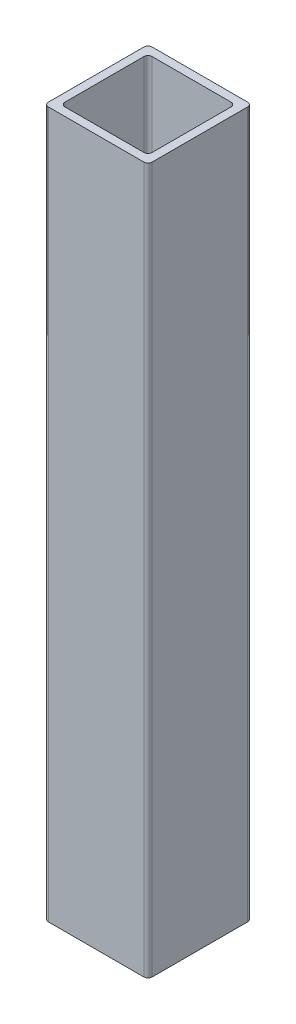
ISO-10303-21;
HEADER;
FILE_DESCRIPTION(('STEP AP214'),'2;1');
FILE_NAME('part.step','',(''),(''),'','','');
FILE_SCHEMA(('AUTOMOTIVE_DESIGN { 1 0 10303 214 1 1 1 1 }'));
ENDSEC;
DATA;
#1=APPLICATION_CONTEXT('core data for automotive mechanical design processes');
#2=APPLICATION_PROTOCOL_DEFINITION('international standard','automotive_design',2000,#1);
#3=PRODUCT_CONTEXT('',#1,'mechanical');
#4=PRODUCT('Part','Part','',(#3));
#5=PRODUCT_RELATED_PRODUCT_CATEGORY('part','',(#4));
#6=PRODUCT_DEFINITION_FORMATION('','',#4);
#7=PRODUCT_DEFINITION_CONTEXT('part definition',#1,'design');
#8=PRODUCT_DEFINITION('design','',#6,#7);
#9=PRODUCT_DEFINITION_SHAPE('','',#8);
#10=(LENGTH_UNIT() NAMED_UNIT(*) SI_UNIT(.MILLI.,.METRE.));
#11=(NAMED_UNIT(*) PLANE_ANGLE_UNIT() SI_UNIT($,.RADIAN.));
#12=(NAMED_UNIT(*) SI_UNIT($,.STERADIAN.) SOLID_ANGLE_UNIT());
#13=UNCERTAINTY_MEASURE_WITH_UNIT(LENGTH_MEASURE(1.E-05),#10,'distance_accuracy_value','');
#14=(GEOMETRIC_REPRESENTATION_CONTEXT(3) GLOBAL_UNCERTAINTY_ASSIGNED_CONTEXT((#13)) GLOBAL_UNIT_ASSIGNED_CONTEXT((#10,
#11,#12)) REPRESENTATION_CONTEXT('',''));
#15=CARTESIAN_POINT('',(0.,0.,0.));
#16=DIRECTION('',(0.,0.,1.));
#17=DIRECTION('',(1.,0.,0.));
#18=AXIS2_PLACEMENT_3D('',#15,#16,#17);
#19=CARTESIAN_POINT('',(-11.5,170.,11.5));
#20=DIRECTION('',(0.,-1.,0.));
#21=DIRECTION('',(0.,0.,-1.));
#22=AXIS2_PLACEMENT_3D('',#19,#20,#21);
#23=PLANE('',#22);
#24=CARTESIAN_POINT('',(-11.5,170.,11.5));
#25=DIRECTION('',(0.,1.,0.));
#26=DIRECTION('',(0.,0.,-1.));
#27=AXIS2_PLACEMENT_3D('',#24,#25,#26);
#28=CIRCLE('',#27,1.);
#29=CARTESIAN_POINT('',(-12.5,170.,11.5));
#30=VERTEX_POINT('',#29);
#31=CARTESIAN_POINT('',(-11.5,170.,12.5));
#32=VERTEX_POINT('',#31);
#33=EDGE_CURVE('E217',#30,#32,#28,.T.);
#34=ORIENTED_EDGE('',*,*,#33,.T.);
#35=DIRECTION('',(1.,0.,0.));
#36=VECTOR('',#35,1.);
#37=CARTESIAN_POINT('',(-11.5,170.,12.5));
#38=LINE('',#37,#36);
#39=CARTESIAN_POINT('',(11.5,170.,12.5));
#40=VERTEX_POINT('',#39);
#41=EDGE_CURVE('E220',#32,#40,#38,.T.);
#42=ORIENTED_EDGE('',*,*,#41,.T.);
#43=CARTESIAN_POINT('',(11.5,170.,11.5));
#44=DIRECTION('',(0.,1.,0.));
#45=DIRECTION('',(0.,0.,1.));
#46=AXIS2_PLACEMENT_3D('',#43,#44,#45);
#47=CIRCLE('',#46,1.);
#48=CARTESIAN_POINT('',(12.5,170.,11.5));
#49=VERTEX_POINT('',#48);
#50=EDGE_CURVE('E223',#40,#49,#47,.T.);
#51=ORIENTED_EDGE('',*,*,#50,.T.);
#52=DIRECTION('',(0.,0.,-1.));
#53=VECTOR('',#52,1.);
#54=CARTESIAN_POINT('',(12.5,170.,11.5));
#55=LINE('',#54,#53);
#56=CARTESIAN_POINT('',(12.5,170.,-11.5));
#57=VERTEX_POINT('',#56);
#58=EDGE_CURVE('E225',#49,#57,#55,.T.);
#59=ORIENTED_EDGE('',*,*,#58,.T.);
#60=CARTESIAN_POINT('',(11.5,170.,-11.5));
#61=DIRECTION('',(0.,1.,0.));
#62=DIRECTION('',(0.,0.,-1.));
#63=AXIS2_PLACEMENT_3D('',#60,#61,#62);
#64=CIRCLE('',#63,1.);
#65=CARTESIAN_POINT('',(11.5,170.,-12.5));
#66=VERTEX_POINT('',#65);
#67=EDGE_CURVE('E227',#57,#66,#64,.T.);
#68=ORIENTED_EDGE('',*,*,#67,.T.);
#69=DIRECTION('',(-1.,0.,0.));
#70=VECTOR('',#69,1.);
#71=CARTESIAN_POINT('',(-11.5,170.,-12.5));
#72=LINE('',#71,#70);
#73=CARTESIAN_POINT('',(-11.5,170.,-12.5));
#74=VERTEX_POINT('',#73);
#75=EDGE_CURVE('E229',#66,#74,#72,.T.);
#76=ORIENTED_EDGE('',*,*,#75,.T.);
#77=CARTESIAN_POINT('',(-11.5,170.,-11.5));
#78=DIRECTION('',(0.,1.,0.));
#79=DIRECTION('',(0.,0.,-1.));
#80=AXIS2_PLACEMENT_3D('',#77,#78,#79);
#81=CIRCLE('',#80,1.);
#82=CARTESIAN_POINT('',(-12.5,170.,-11.5));
#83=VERTEX_POINT('',#82);
#84=EDGE_CURVE('E231',#74,#83,#81,.T.);
#85=ORIENTED_EDGE('',*,*,#84,.T.);
#86=DIRECTION('',(0.,0.,1.));
#87=VECTOR('',#86,1.);
#88=CARTESIAN_POINT('',(-12.5,170.,11.5));
#89=LINE('',#88,#87);
#90=EDGE_CURVE('E233',#83,#30,#89,.T.);
#91=ORIENTED_EDGE('',*,*,#90,.T.);
#92=EDGE_LOOP('',(#34,#42,#51,#59,#68,#76,#85,#91));
#93=FACE_BOUND('',#92,.T.);
#94=CARTESIAN_POINT('',(-9.5,170.,9.5));
#95=DIRECTION('',(0.,1.,0.));
#96=DIRECTION('',(0.,0.,-1.));
#97=AXIS2_PLACEMENT_3D('',#94,#95,#96);
#98=CIRCLE('',#97,1.);
#99=CARTESIAN_POINT('',(-10.5,170.,9.5));
#100=VERTEX_POINT('',#99);
#101=CARTESIAN_POINT('',(-9.5,170.,10.5));
#102=VERTEX_POINT('',#101);
#103=EDGE_CURVE('E152',#100,#102,#98,.T.);
#104=ORIENTED_EDGE('',*,*,#103,.F.);
#105=DIRECTION('',(0.,0.,1.));
#106=VECTOR('',#105,1.);
#107=CARTESIAN_POINT('',(-10.5,170.,9.5));
#108=LINE('',#107,#106);
#109=CARTESIAN_POINT('',(-10.5,170.,-9.5));
#110=VERTEX_POINT('',#109);
#111=EDGE_CURVE('E185',#110,#100,#108,.T.);
#112=ORIENTED_EDGE('',*,*,#111,.F.);
#113=CARTESIAN_POINT('',(-9.5,170.,-9.5));
#114=DIRECTION('',(0.,1.,0.));
#115=DIRECTION('',(0.,0.,-1.));
#116=AXIS2_PLACEMENT_3D('',#113,#114,#115);
#117=CIRCLE('',#116,1.);
#118=CARTESIAN_POINT('',(-9.5,170.,-10.5));
#119=VERTEX_POINT('',#118);
#120=EDGE_CURVE('E183',#119,#110,#117,.T.);
#121=ORIENTED_EDGE('',*,*,#120,.F.);
#122=DIRECTION('',(-1.,0.,0.));
#123=VECTOR('',#122,1.);
#124=CARTESIAN_POINT('',(-9.5,170.,-10.5));
#125=LINE('',#124,#123);
#126=CARTESIAN_POINT('',(9.5,170.,-10.5));
#127=VERTEX_POINT('',#126);
#128=EDGE_CURVE('E181',#127,#119,#125,.T.);
#129=ORIENTED_EDGE('',*,*,#128,.F.);
#130=CARTESIAN_POINT('',(9.5,170.,-9.5));
#131=DIRECTION('',(0.,1.,0.));
#132=DIRECTION('',(0.,0.,-1.));
#133=AXIS2_PLACEMENT_3D('',#130,#131,#132);
#134=CIRCLE('',#133,1.);
#135=CARTESIAN_POINT('',(10.5,170.,-9.5));
#136=VERTEX_POINT('',#135);
#137=EDGE_CURVE('E179',#136,#127,#134,.T.);
#138=ORIENTED_EDGE('',*,*,#137,.F.);
#139=DIRECTION('',(0.,0.,-1.));
#140=VECTOR('',#139,1.);
#141=CARTESIAN_POINT('',(10.5,170.,9.5));
#142=LINE('',#141,#140);
#143=CARTESIAN_POINT('',(10.5,170.,9.5));
#144=VERTEX_POINT('',#143);
#145=EDGE_CURVE('E175',#144,#136,#142,.T.);
#146=ORIENTED_EDGE('',*,*,#145,.F.);
#147=CARTESIAN_POINT('',(9.5,170.,9.5));
#148=DIRECTION('',(0.,1.,0.));
#149=DIRECTION('',(0.,0.,1.));
#150=AXIS2_PLACEMENT_3D('',#147,#148,#149);
#151=CIRCLE('',#150,1.);
#152=CARTESIAN_POINT('',(9.5,170.,10.5));
#153=VERTEX_POINT('',#152);
#154=EDGE_CURVE('E173',#153,#144,#151,.T.);
#155=ORIENTED_EDGE('',*,*,#154,.F.);
#156=DIRECTION('',(1.,0.,0.));
#157=VECTOR('',#156,1.);
#158=CARTESIAN_POINT('',(-9.5,170.,10.5));
#159=LINE('',#158,#157);
#160=EDGE_CURVE('E160',#102,#153,#159,.T.);
#161=ORIENTED_EDGE('',*,*,#160,.F.);
#162=EDGE_LOOP('',(#104,#112,#121,#129,#138,#146,#155,#161));
#163=FACE_BOUND('',#162,.T.);
#164=ADVANCED_FACE('F39',(#93,#163),#23,.F.);
#165=CARTESIAN_POINT('',(-11.5,0.,11.5));
#166=DIRECTION('',(0.,-1.,0.));
#167=DIRECTION('',(0.,0.,-1.));
#168=AXIS2_PLACEMENT_3D('',#165,#166,#167);
#169=PLANE('',#168);
#170=CARTESIAN_POINT('',(-11.5,0.,11.5));
#171=DIRECTION('',(0.,1.,0.));
#172=DIRECTION('',(0.,0.,-1.));
#173=AXIS2_PLACEMENT_3D('',#170,#171,#172);
#174=CIRCLE('',#173,1.);
#175=CARTESIAN_POINT('',(-12.5,0.,11.5));
#176=VERTEX_POINT('',#175);
#177=CARTESIAN_POINT('',(-11.5,0.,12.5));
#178=VERTEX_POINT('',#177);
#179=EDGE_CURVE('E168',#176,#178,#174,.T.);
#180=ORIENTED_EDGE('',*,*,#179,.F.);
#181=DIRECTION('',(0.,0.,1.));
#182=VECTOR('',#181,1.);
#183=CARTESIAN_POINT('',(-12.5,0.,11.5));
#184=LINE('',#183,#182);
#185=CARTESIAN_POINT('',(-12.5,0.,-11.5));
#186=VERTEX_POINT('',#185);
#187=EDGE_CURVE('E221',#186,#176,#184,.T.);
#188=ORIENTED_EDGE('',*,*,#187,.F.);
#189=CARTESIAN_POINT('',(-11.5,0.,-11.5));
#190=DIRECTION('',(0.,1.,0.));
#191=DIRECTION('',(0.,0.,-1.));
#192=AXIS2_PLACEMENT_3D('',#189,#190,#191);
#193=CIRCLE('',#192,1.);
#194=CARTESIAN_POINT('',(-11.5,0.,-12.5));
#195=VERTEX_POINT('',#194);
#196=EDGE_CURVE('E248',#195,#186,#193,.T.);
#197=ORIENTED_EDGE('',*,*,#196,.F.);
#198=DIRECTION('',(-1.,0.,0.));
#199=VECTOR('',#198,1.);
#200=CARTESIAN_POINT('',(-11.5,0.,-12.5));
#201=LINE('',#200,#199);
#202=CARTESIAN_POINT('',(11.5,0.,-12.5));
#203=VERTEX_POINT('',#202);
#204=EDGE_CURVE('E246',#203,#195,#201,.T.);
#205=ORIENTED_EDGE('',*,*,#204,.F.);
#206=CARTESIAN_POINT('',(11.5,0.,-11.5));
#207=DIRECTION('',(0.,1.,0.));
#208=DIRECTION('',(0.,0.,-1.));
#209=AXIS2_PLACEMENT_3D('',#206,#207,#208);
#210=CIRCLE('',#209,1.);
#211=CARTESIAN_POINT('',(12.5,0.,-11.5));
#212=VERTEX_POINT('',#211);
#213=EDGE_CURVE('E244',#212,#203,#210,.T.);
#214=ORIENTED_EDGE('',*,*,#213,.F.);
#215=DIRECTION('',(0.,0.,-1.));
#216=VECTOR('',#215,1.);
#217=CARTESIAN_POINT('',(12.5,0.,11.5));
#218=LINE('',#217,#216);
#219=CARTESIAN_POINT('',(12.5,0.,11.5));
#220=VERTEX_POINT('',#219);
#221=EDGE_CURVE('E242',#220,#212,#218,.T.);
#222=ORIENTED_EDGE('',*,*,#221,.F.);
#223=CARTESIAN_POINT('',(11.5,0.,11.5));
#224=DIRECTION('',(0.,1.,0.));
#225=DIRECTION('',(0.,0.,1.));
#226=AXIS2_PLACEMENT_3D('',#223,#224,#225);
#227=CIRCLE('',#226,1.);
#228=CARTESIAN_POINT('',(11.5,0.,12.5));
#229=VERTEX_POINT('',#228);
#230=EDGE_CURVE('E240',#229,#220,#227,.T.);
#231=ORIENTED_EDGE('',*,*,#230,.F.);
#232=DIRECTION('',(1.,0.,0.));
#233=VECTOR('',#232,1.);
#234=CARTESIAN_POINT('',(-11.5,0.,12.5));
#235=LINE('',#234,#233);
#236=EDGE_CURVE('E238',#178,#229,#235,.T.);
#237=ORIENTED_EDGE('',*,*,#236,.F.);
#238=EDGE_LOOP('',(#180,#188,#197,#205,#214,#222,#231,#237));
#239=FACE_BOUND('',#238,.T.);
#240=DIRECTION('',(0.,0.,1.));
#241=VECTOR('',#240,1.);
#242=CARTESIAN_POINT('',(-10.5,0.,9.5));
#243=LINE('',#242,#241);
#244=CARTESIAN_POINT('',(-10.5,0.,-9.5));
#245=VERTEX_POINT('',#244);
#246=CARTESIAN_POINT('',(-10.5,0.,9.5));
#247=VERTEX_POINT('',#246);
#248=EDGE_CURVE('E161',#245,#247,#243,.T.);
#249=ORIENTED_EDGE('',*,*,#248,.T.);
#250=CARTESIAN_POINT('',(-9.5,0.,9.5));
#251=DIRECTION('',(0.,1.,0.));
#252=DIRECTION('',(0.,0.,-1.));
#253=AXIS2_PLACEMENT_3D('',#250,#251,#252);
#254=CIRCLE('',#253,1.);
#255=CARTESIAN_POINT('',(-9.5,0.,10.5));
#256=VERTEX_POINT('',#255);
#257=EDGE_CURVE('E62',#247,#256,#254,.T.);
#258=ORIENTED_EDGE('',*,*,#257,.T.);
#259=DIRECTION('',(1.,0.,0.));
#260=VECTOR('',#259,1.);
#261=CARTESIAN_POINT('',(-9.5,0.,10.5));
#262=LINE('',#261,#260);
#263=CARTESIAN_POINT('',(9.5,0.,10.5));
#264=VERTEX_POINT('',#263);
#265=EDGE_CURVE('E167',#256,#264,#262,.T.);
#266=ORIENTED_EDGE('',*,*,#265,.T.);
#267=CARTESIAN_POINT('',(9.5,0.,9.5));
#268=DIRECTION('',(0.,1.,0.));
#269=DIRECTION('',(0.,0.,1.));
#270=AXIS2_PLACEMENT_3D('',#267,#268,#269);
#271=CIRCLE('',#270,1.);
#272=CARTESIAN_POINT('',(10.5,0.,9.5));
#273=VERTEX_POINT('',#272);
#274=EDGE_CURVE('E189',#264,#273,#271,.T.);
#275=ORIENTED_EDGE('',*,*,#274,.T.);
#276=DIRECTION('',(0.,0.,-1.));
#277=VECTOR('',#276,1.);
#278=CARTESIAN_POINT('',(10.5,0.,9.5));
#279=LINE('',#278,#277);
#280=CARTESIAN_POINT('',(10.5,0.,-9.5));
#281=VERTEX_POINT('',#280);
#282=EDGE_CURVE('E192',#273,#281,#279,.T.);
#283=ORIENTED_EDGE('',*,*,#282,.T.);
#284=CARTESIAN_POINT('',(9.5,0.,-9.5));
#285=DIRECTION('',(0.,1.,0.));
#286=DIRECTION('',(0.,0.,-1.));
#287=AXIS2_PLACEMENT_3D('',#284,#285,#286);
#288=CIRCLE('',#287,1.);
#289=CARTESIAN_POINT('',(9.5,0.,-10.5));
#290=VERTEX_POINT('',#289);
#291=EDGE_CURVE('E195',#281,#290,#288,.T.);
#292=ORIENTED_EDGE('',*,*,#291,.T.);
#293=DIRECTION('',(-1.,0.,0.));
#294=VECTOR('',#293,1.);
#295=CARTESIAN_POINT('',(-9.5,0.,-10.5));
#296=LINE('',#295,#294);
#297=CARTESIAN_POINT('',(-9.5,0.,-10.5));
#298=VERTEX_POINT('',#297);
#299=EDGE_CURVE('E198',#290,#298,#296,.T.);
#300=ORIENTED_EDGE('',*,*,#299,.T.);
#301=CARTESIAN_POINT('',(-9.5,0.,-9.5));
#302=DIRECTION('',(0.,1.,0.));
#303=DIRECTION('',(0.,0.,-1.));
#304=AXIS2_PLACEMENT_3D('',#301,#302,#303);
#305=CIRCLE('',#304,1.);
#306=EDGE_CURVE('E201',#298,#245,#305,.T.);
#307=ORIENTED_EDGE('',*,*,#306,.T.);
#308=EDGE_LOOP('',(#249,#258,#266,#275,#283,#292,#300,#307));
#309=FACE_BOUND('',#308,.T.);
#310=ADVANCED_FACE('F278',(#239,#309),#169,.T.);
#311=CARTESIAN_POINT('',(-11.5,170.,11.5));
#312=DIRECTION('',(0.,-1.,0.));
#313=DIRECTION('',(0.,0.,-1.));
#314=AXIS2_PLACEMENT_3D('',#311,#312,#313);
#315=CYLINDRICAL_SURFACE('',#314,1.);
#316=ORIENTED_EDGE('',*,*,#179,.T.);
#317=DIRECTION('',(0.,-1.,0.));
#318=VECTOR('',#317,1.);
#319=CARTESIAN_POINT('',(-11.5,170.,12.5));
#320=LINE('',#319,#318);
#321=EDGE_CURVE('E11',#32,#178,#320,.T.);
#322=ORIENTED_EDGE('',*,*,#321,.F.);
#323=ORIENTED_EDGE('',*,*,#33,.F.);
#324=DIRECTION('',(0.,-1.,0.));
#325=VECTOR('',#324,1.);
#326=CARTESIAN_POINT('',(-12.5,170.,11.5));
#327=LINE('',#326,#325);
#328=EDGE_CURVE('E235',#30,#176,#327,.T.);
#329=ORIENTED_EDGE('',*,*,#328,.T.);
#330=EDGE_LOOP('',(#316,#322,#323,#329));
#331=FACE_BOUND('',#330,.T.);
#332=ADVANCED_FACE('F41',(#331),#315,.T.);
#333=CARTESIAN_POINT('',(-11.5,170.,12.5));
#334=DIRECTION('',(0.,0.,-1.));
#335=DIRECTION('',(-1.,0.,0.));
#336=AXIS2_PLACEMENT_3D('',#333,#334,#335);
#337=PLANE('',#336);
#338=ORIENTED_EDGE('',*,*,#236,.T.);
#339=DIRECTION('',(0.,-1.,0.));
#340=VECTOR('',#339,1.);
#341=CARTESIAN_POINT('',(11.5,170.,12.5));
#342=LINE('',#341,#340);
#343=EDGE_CURVE('E47',#40,#229,#342,.T.);
#344=ORIENTED_EDGE('',*,*,#343,.F.);
#345=ORIENTED_EDGE('',*,*,#41,.F.);
#346=ORIENTED_EDGE('',*,*,#321,.T.);
#347=EDGE_LOOP('',(#338,#344,#345,#346));
#348=FACE_BOUND('',#347,.T.);
#349=ADVANCED_FACE('F295',(#348),#337,.F.);
#350=CARTESIAN_POINT('',(11.5,170.,11.5));
#351=DIRECTION('',(0.,-1.,0.));
#352=DIRECTION('',(0.,0.,-1.));
#353=AXIS2_PLACEMENT_3D('',#350,#351,#352);
#354=CYLINDRICAL_SURFACE('',#353,1.);
#355=ORIENTED_EDGE('',*,*,#230,.T.);
#356=DIRECTION('',(0.,-1.,0.));
#357=VECTOR('',#356,1.);
#358=CARTESIAN_POINT('',(12.5,170.,11.5));
#359=LINE('',#358,#357);
#360=EDGE_CURVE('E265',#49,#220,#359,.T.);
#361=ORIENTED_EDGE('',*,*,#360,.F.);
#362=ORIENTED_EDGE('',*,*,#50,.F.);
#363=ORIENTED_EDGE('',*,*,#343,.T.);
#364=EDGE_LOOP('',(#355,#361,#362,#363));
#365=FACE_BOUND('',#364,.T.);
#366=ADVANCED_FACE('F272',(#365),#354,.T.);
#367=CARTESIAN_POINT('',(12.5,170.,11.5));
#368=DIRECTION('',(-1.,0.,0.));
#369=DIRECTION('',(0.,0.,1.));
#370=AXIS2_PLACEMENT_3D('',#367,#368,#369);
#371=PLANE('',#370);
#372=ORIENTED_EDGE('',*,*,#221,.T.);
#373=DIRECTION('',(0.,-1.,0.));
#374=VECTOR('',#373,1.);
#375=CARTESIAN_POINT('',(12.5,170.,-11.5));
#376=LINE('',#375,#374);
#377=EDGE_CURVE('E262',#57,#212,#376,.T.);
#378=ORIENTED_EDGE('',*,*,#377,.F.);
#379=ORIENTED_EDGE('',*,*,#58,.F.);
#380=ORIENTED_EDGE('',*,*,#360,.T.);
#381=EDGE_LOOP('',(#372,#378,#379,#380));
#382=FACE_BOUND('',#381,.T.);
#383=ADVANCED_FACE('F284',(#382),#371,.F.);
#384=CARTESIAN_POINT('',(11.5,170.,-11.5));
#385=DIRECTION('',(0.,-1.,0.));
#386=DIRECTION('',(0.,0.,-1.));
#387=AXIS2_PLACEMENT_3D('',#384,#385,#386);
#388=CYLINDRICAL_SURFACE('',#387,1.);
#389=ORIENTED_EDGE('',*,*,#213,.T.);
#390=DIRECTION('',(0.,-1.,0.));
#391=VECTOR('',#390,1.);
#392=CARTESIAN_POINT('',(11.5,170.,-12.5));
#393=LINE('',#392,#391);
#394=EDGE_CURVE('E259',#66,#203,#393,.T.);
#395=ORIENTED_EDGE('',*,*,#394,.F.);
#396=ORIENTED_EDGE('',*,*,#67,.F.);
#397=ORIENTED_EDGE('',*,*,#377,.T.);
#398=EDGE_LOOP('',(#389,#395,#396,#397));
#399=FACE_BOUND('',#398,.T.);
#400=ADVANCED_FACE('F288',(#399),#388,.T.);
#401=CARTESIAN_POINT('',(-11.5,170.,-12.5));
#402=DIRECTION('',(0.,0.,1.));
#403=DIRECTION('',(1.,0.,0.));
#404=AXIS2_PLACEMENT_3D('',#401,#402,#403);
#405=PLANE('',#404);
#406=ORIENTED_EDGE('',*,*,#204,.T.);
#407=DIRECTION('',(0.,-1.,0.));
#408=VECTOR('',#407,1.);
#409=CARTESIAN_POINT('',(-11.5,170.,-12.5));
#410=LINE('',#409,#408);
#411=EDGE_CURVE('E256',#74,#195,#410,.T.);
#412=ORIENTED_EDGE('',*,*,#411,.F.);
#413=ORIENTED_EDGE('',*,*,#75,.F.);
#414=ORIENTED_EDGE('',*,*,#394,.T.);
#415=EDGE_LOOP('',(#406,#412,#413,#414));
#416=FACE_BOUND('',#415,.T.);
#417=ADVANCED_FACE('F308',(#416),#405,.F.);
#418=CARTESIAN_POINT('',(-11.5,170.,-11.5));
#419=DIRECTION('',(0.,-1.,0.));
#420=DIRECTION('',(0.,0.,-1.));
#421=AXIS2_PLACEMENT_3D('',#418,#419,#420);
#422=CYLINDRICAL_SURFACE('',#421,1.);
#423=ORIENTED_EDGE('',*,*,#196,.T.);
#424=DIRECTION('',(0.,-1.,0.));
#425=VECTOR('',#424,1.);
#426=CARTESIAN_POINT('',(-12.5,170.,-11.5));
#427=LINE('',#426,#425);
#428=EDGE_CURVE('E253',#83,#186,#427,.T.);
#429=ORIENTED_EDGE('',*,*,#428,.F.);
#430=ORIENTED_EDGE('',*,*,#84,.F.);
#431=ORIENTED_EDGE('',*,*,#411,.T.);
#432=EDGE_LOOP('',(#423,#429,#430,#431));
#433=FACE_BOUND('',#432,.T.);
#434=ADVANCED_FACE('F306',(#433),#422,.T.);
#435=CARTESIAN_POINT('',(-12.5,170.,11.5));
#436=DIRECTION('',(1.,0.,0.));
#437=DIRECTION('',(0.,0.,-1.));
#438=AXIS2_PLACEMENT_3D('',#435,#436,#437);
#439=PLANE('',#438);
#440=ORIENTED_EDGE('',*,*,#187,.T.);
#441=ORIENTED_EDGE('',*,*,#328,.F.);
#442=ORIENTED_EDGE('',*,*,#90,.F.);
#443=ORIENTED_EDGE('',*,*,#428,.T.);
#444=EDGE_LOOP('',(#440,#441,#442,#443));
#445=FACE_BOUND('',#444,.T.);
#446=ADVANCED_FACE('F301',(#445),#439,.F.);
#447=CARTESIAN_POINT('',(-9.5,170.,9.5));
#448=DIRECTION('',(0.,-1.,0.));
#449=DIRECTION('',(0.,0.,-1.));
#450=AXIS2_PLACEMENT_3D('',#447,#448,#449);
#451=CYLINDRICAL_SURFACE('',#450,1.);
#452=ORIENTED_EDGE('',*,*,#257,.F.);
#453=DIRECTION('',(0.,-1.,0.));
#454=VECTOR('',#453,1.);
#455=CARTESIAN_POINT('',(-10.5,170.,9.5));
#456=LINE('',#455,#454);
#457=EDGE_CURVE('E156',#100,#247,#456,.T.);
#458=ORIENTED_EDGE('',*,*,#457,.F.);
#459=ORIENTED_EDGE('',*,*,#103,.T.);
#460=DIRECTION('',(0.,-1.,0.));
#461=VECTOR('',#460,1.);
#462=CARTESIAN_POINT('',(-9.5,170.,10.5));
#463=LINE('',#462,#461);
#464=EDGE_CURVE('E155',#102,#256,#463,.T.);
#465=ORIENTED_EDGE('',*,*,#464,.T.);
#466=EDGE_LOOP('',(#452,#458,#459,#465));
#467=FACE_BOUND('',#466,.T.);
#468=ADVANCED_FACE('F154',(#467),#451,.F.);
#469=CARTESIAN_POINT('',(-9.5,170.,10.5));
#470=DIRECTION('',(0.,0.,-1.));
#471=DIRECTION('',(-1.,0.,0.));
#472=AXIS2_PLACEMENT_3D('',#469,#470,#471);
#473=PLANE('',#472);
#474=ORIENTED_EDGE('',*,*,#265,.F.);
#475=ORIENTED_EDGE('',*,*,#464,.F.);
#476=ORIENTED_EDGE('',*,*,#160,.T.);
#477=DIRECTION('',(0.,-1.,0.));
#478=VECTOR('',#477,1.);
#479=CARTESIAN_POINT('',(9.5,170.,10.5));
#480=LINE('',#479,#478);
#481=EDGE_CURVE('E169',#153,#264,#480,.T.);
#482=ORIENTED_EDGE('',*,*,#481,.T.);
#483=EDGE_LOOP('',(#474,#475,#476,#482));
#484=FACE_BOUND('',#483,.T.);
#485=ADVANCED_FACE('F164',(#484),#473,.T.);
#486=CARTESIAN_POINT('',(9.5,170.,9.5));
#487=DIRECTION('',(0.,-1.,0.));
#488=DIRECTION('',(0.,0.,-1.));
#489=AXIS2_PLACEMENT_3D('',#486,#487,#488);
#490=CYLINDRICAL_SURFACE('',#489,1.);
#491=ORIENTED_EDGE('',*,*,#274,.F.);
#492=ORIENTED_EDGE('',*,*,#481,.F.);
#493=ORIENTED_EDGE('',*,*,#154,.T.);
#494=DIRECTION('',(0.,-1.,0.));
#495=VECTOR('',#494,1.);
#496=CARTESIAN_POINT('',(10.5,170.,9.5));
#497=LINE('',#496,#495);
#498=EDGE_CURVE('E214',#144,#273,#497,.T.);
#499=ORIENTED_EDGE('',*,*,#498,.T.);
#500=EDGE_LOOP('',(#491,#492,#493,#499));
#501=FACE_BOUND('',#500,.T.);
#502=ADVANCED_FACE('F333',(#501),#490,.F.);
#503=CARTESIAN_POINT('',(10.5,170.,9.5));
#504=DIRECTION('',(-1.,0.,0.));
#505=DIRECTION('',(0.,0.,1.));
#506=AXIS2_PLACEMENT_3D('',#503,#504,#505);
#507=PLANE('',#506);
#508=ORIENTED_EDGE('',*,*,#282,.F.);
#509=ORIENTED_EDGE('',*,*,#498,.F.);
#510=ORIENTED_EDGE('',*,*,#145,.T.);
#511=DIRECTION('',(0.,-1.,0.));
#512=VECTOR('',#511,1.);
#513=CARTESIAN_POINT('',(10.5,170.,-9.5));
#514=LINE('',#513,#512);
#515=EDGE_CURVE('E212',#136,#281,#514,.T.);
#516=ORIENTED_EDGE('',*,*,#515,.T.);
#517=EDGE_LOOP('',(#508,#509,#510,#516));
#518=FACE_BOUND('',#517,.T.);
#519=ADVANCED_FACE('F337',(#518),#507,.T.);
#520=CARTESIAN_POINT('',(9.5,170.,-9.5));
#521=DIRECTION('',(0.,-1.,0.));
#522=DIRECTION('',(0.,0.,-1.));
#523=AXIS2_PLACEMENT_3D('',#520,#521,#522);
#524=CYLINDRICAL_SURFACE('',#523,1.);
#525=ORIENTED_EDGE('',*,*,#291,.F.);
#526=ORIENTED_EDGE('',*,*,#515,.F.);
#527=ORIENTED_EDGE('',*,*,#137,.T.);
#528=DIRECTION('',(0.,-1.,0.));
#529=VECTOR('',#528,1.);
#530=CARTESIAN_POINT('',(9.5,170.,-10.5));
#531=LINE('',#530,#529);
#532=EDGE_CURVE('E210',#127,#290,#531,.T.);
#533=ORIENTED_EDGE('',*,*,#532,.T.);
#534=EDGE_LOOP('',(#525,#526,#527,#533));
#535=FACE_BOUND('',#534,.T.);
#536=ADVANCED_FACE('F343',(#535),#524,.F.);
#537=CARTESIAN_POINT('',(-9.5,170.,-10.5));
#538=DIRECTION('',(0.,0.,1.));
#539=DIRECTION('',(1.,0.,0.));
#540=AXIS2_PLACEMENT_3D('',#537,#538,#539);
#541=PLANE('',#540);
#542=ORIENTED_EDGE('',*,*,#299,.F.);
#543=ORIENTED_EDGE('',*,*,#532,.F.);
#544=ORIENTED_EDGE('',*,*,#128,.T.);
#545=DIRECTION('',(0.,-1.,0.));
#546=VECTOR('',#545,1.);
#547=CARTESIAN_POINT('',(-9.5,170.,-10.5));
#548=LINE('',#547,#546);
#549=EDGE_CURVE('E208',#119,#298,#548,.T.);
#550=ORIENTED_EDGE('',*,*,#549,.T.);
#551=EDGE_LOOP('',(#542,#543,#544,#550));
#552=FACE_BOUND('',#551,.T.);
#553=ADVANCED_FACE('F347',(#552),#541,.T.);
#554=CARTESIAN_POINT('',(-9.5,170.,-9.5));
#555=DIRECTION('',(0.,-1.,0.));
#556=DIRECTION('',(0.,0.,-1.));
#557=AXIS2_PLACEMENT_3D('',#554,#555,#556);
#558=CYLINDRICAL_SURFACE('',#557,1.);
#559=ORIENTED_EDGE('',*,*,#306,.F.);
#560=ORIENTED_EDGE('',*,*,#549,.F.);
#561=ORIENTED_EDGE('',*,*,#120,.T.);
#562=DIRECTION('',(0.,-1.,0.));
#563=VECTOR('',#562,1.);
#564=CARTESIAN_POINT('',(-10.5,170.,-9.5));
#565=LINE('',#564,#563);
#566=EDGE_CURVE('E54',#110,#245,#565,.T.);
#567=ORIENTED_EDGE('',*,*,#566,.T.);
#568=EDGE_LOOP('',(#559,#560,#561,#567));
#569=FACE_BOUND('',#568,.T.);
#570=ADVANCED_FACE('F351',(#569),#558,.F.);
#571=CARTESIAN_POINT('',(-10.5,170.,9.5));
#572=DIRECTION('',(1.,0.,0.));
#573=DIRECTION('',(0.,0.,-1.));
#574=AXIS2_PLACEMENT_3D('',#571,#572,#573);
#575=PLANE('',#574);
#576=ORIENTED_EDGE('',*,*,#248,.F.);
#577=ORIENTED_EDGE('',*,*,#566,.F.);
#578=ORIENTED_EDGE('',*,*,#111,.T.);
#579=ORIENTED_EDGE('',*,*,#457,.T.);
#580=EDGE_LOOP('',(#576,#577,#578,#579));
#581=FACE_BOUND('',#580,.T.);
#582=ADVANCED_FACE('F355',(#581),#575,.T.);
#583=CLOSED_SHELL('',(#164,#310,#332,#349,#366,#383,#400,#417,#434,#446,#468,#485,#502,#519,
#536,#553,#570,#582));
#584=MANIFOLD_SOLID_BREP('B2',#583);
#585=ADVANCED_BREP_SHAPE_REPRESENTATION('',(#18,#584),#14);
#586=SHAPE_DEFINITION_REPRESENTATION(#9,#585);
ENDSEC;
END-ISO-10303-21;
